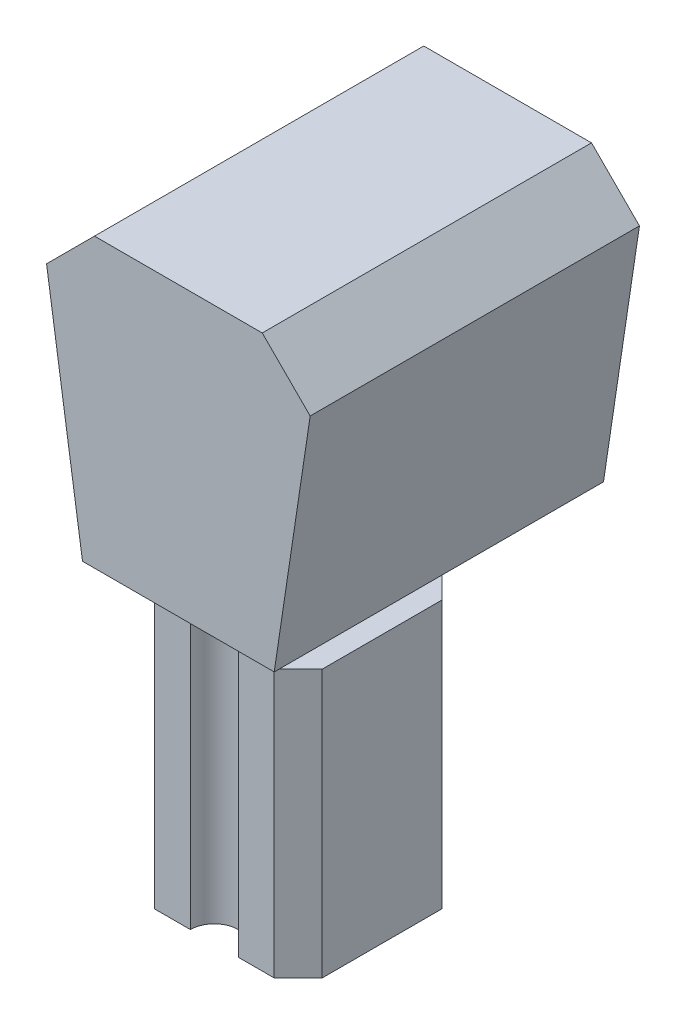
ISO-10303-21;
HEADER;
FILE_DESCRIPTION(('STEP AP214'),'2;1');
FILE_NAME('part.step','',(''),(''),'','','');
FILE_SCHEMA(('AUTOMOTIVE_DESIGN { 1 0 10303 214 1 1 1 1 }'));
ENDSEC;
DATA;
#1=APPLICATION_CONTEXT('core data for automotive mechanical design processes');
#2=APPLICATION_PROTOCOL_DEFINITION('international standard','automotive_design',2000,#1);
#3=PRODUCT_CONTEXT('',#1,'mechanical');
#4=PRODUCT('Part','Part','',(#3));
#5=PRODUCT_RELATED_PRODUCT_CATEGORY('part','',(#4));
#6=PRODUCT_DEFINITION_FORMATION('','',#4);
#7=PRODUCT_DEFINITION_CONTEXT('part definition',#1,'design');
#8=PRODUCT_DEFINITION('design','',#6,#7);
#9=PRODUCT_DEFINITION_SHAPE('','',#8);
#10=(LENGTH_UNIT() NAMED_UNIT(*) SI_UNIT(.MILLI.,.METRE.));
#11=(NAMED_UNIT(*) PLANE_ANGLE_UNIT() SI_UNIT($,.RADIAN.));
#12=(NAMED_UNIT(*) SI_UNIT($,.STERADIAN.) SOLID_ANGLE_UNIT());
#13=UNCERTAINTY_MEASURE_WITH_UNIT(LENGTH_MEASURE(1.E-05),#10,'distance_accuracy_value','');
#14=(GEOMETRIC_REPRESENTATION_CONTEXT(3) GLOBAL_UNCERTAINTY_ASSIGNED_CONTEXT((#13)) GLOBAL_UNIT_ASSIGNED_CONTEXT((#10,
#11,#12)) REPRESENTATION_CONTEXT('',''));
#15=CARTESIAN_POINT('',(0.,0.,0.));
#16=DIRECTION('',(0.,0.,1.));
#17=DIRECTION('',(1.,0.,0.));
#18=AXIS2_PLACEMENT_3D('',#15,#16,#17);
#19=CARTESIAN_POINT('',(-175.,-558.,-125.));
#20=DIRECTION('',(-1.,0.,0.));
#21=DIRECTION('',(0.,0.,1.));
#22=AXIS2_PLACEMENT_3D('',#19,#20,#21);
#23=PLANE('',#22);
#24=DIRECTION('',(0.,0.,1.));
#25=VECTOR('',#24,1.);
#26=CARTESIAN_POINT('',(-175.,0.,-125.));
#27=LINE('',#26,#25);
#28=CARTESIAN_POINT('',(-175.,0.,-375.));
#29=VERTEX_POINT('',#28);
#30=CARTESIAN_POINT('',(-175.,0.,-125.));
#31=VERTEX_POINT('',#30);
#32=EDGE_CURVE('E178',#29,#31,#27,.T.);
#33=ORIENTED_EDGE('',*,*,#32,.F.);
#34=DIRECTION('',(0.,1.,0.));
#35=VECTOR('',#34,1.);
#36=CARTESIAN_POINT('',(-175.,-558.,-375.));
#37=LINE('',#36,#35);
#38=CARTESIAN_POINT('',(-175.,-558.,-375.));
#39=VERTEX_POINT('',#38);
#40=EDGE_CURVE('E12',#39,#29,#37,.T.);
#41=ORIENTED_EDGE('',*,*,#40,.F.);
#42=DIRECTION('',(0.,0.,1.));
#43=VECTOR('',#42,1.);
#44=CARTESIAN_POINT('',(-175.,-558.,-125.));
#45=LINE('',#44,#43);
#46=CARTESIAN_POINT('',(-175.,-558.,-125.));
#47=VERTEX_POINT('',#46);
#48=EDGE_CURVE('E210',#39,#47,#45,.T.);
#49=ORIENTED_EDGE('',*,*,#48,.T.);
#50=DIRECTION('',(0.,1.,0.));
#51=VECTOR('',#50,1.);
#52=CARTESIAN_POINT('',(-175.,-558.,-125.));
#53=LINE('',#52,#51);
#54=EDGE_CURVE('E60',#47,#31,#53,.T.);
#55=ORIENTED_EDGE('',*,*,#54,.T.);
#56=EDGE_LOOP('',(#33,#41,#49,#55));
#57=FACE_BOUND('',#56,.T.);
#58=ADVANCED_FACE('F57',(#57),#23,.T.);
#59=CARTESIAN_POINT('',(-175.,-558.,-375.));
#60=DIRECTION('',(-0.707106781186547,0.,-0.707106781186548));
#61=DIRECTION('',(-0.707106781186548,0.,0.707106781186547));
#62=AXIS2_PLACEMENT_3D('',#59,#60,#61);
#63=PLANE('',#62);
#64=DIRECTION('',(-0.707106781186548,0.,0.707106781186547));
#65=VECTOR('',#64,1.);
#66=CARTESIAN_POINT('',(-175.,0.,-375.));
#67=LINE('',#66,#65);
#68=CARTESIAN_POINT('',(-125.,0.,-425.));
#69=VERTEX_POINT('',#68);
#70=EDGE_CURVE('E208',#69,#29,#67,.T.);
#71=ORIENTED_EDGE('',*,*,#70,.F.);
#72=DIRECTION('',(0.,1.,0.));
#73=VECTOR('',#72,1.);
#74=CARTESIAN_POINT('',(-125.,-558.,-425.));
#75=LINE('',#74,#73);
#76=CARTESIAN_POINT('',(-125.,-558.,-425.));
#77=VERTEX_POINT('',#76);
#78=EDGE_CURVE('E66',#77,#69,#75,.T.);
#79=ORIENTED_EDGE('',*,*,#78,.F.);
#80=DIRECTION('',(-0.707106781186548,0.,0.707106781186547));
#81=VECTOR('',#80,1.);
#82=CARTESIAN_POINT('',(-175.,-558.,-375.));
#83=LINE('',#82,#81);
#84=EDGE_CURVE('E168',#77,#39,#83,.T.);
#85=ORIENTED_EDGE('',*,*,#84,.T.);
#86=ORIENTED_EDGE('',*,*,#40,.T.);
#87=EDGE_LOOP('',(#71,#79,#85,#86));
#88=FACE_BOUND('',#87,.T.);
#89=ADVANCED_FACE('F230',(#88),#63,.T.);
#90=CARTESIAN_POINT('',(-125.,-558.,-425.));
#91=DIRECTION('',(0.,0.,-1.));
#92=DIRECTION('',(-1.,0.,0.));
#93=AXIS2_PLACEMENT_3D('',#90,#91,#92);
#94=PLANE('',#93);
#95=DIRECTION('',(-1.,0.,0.));
#96=VECTOR('',#95,1.);
#97=CARTESIAN_POINT('',(-125.,0.,-425.));
#98=LINE('',#97,#96);
#99=CARTESIAN_POINT('',(-50.,0.,-425.));
#100=VERTEX_POINT('',#99);
#101=EDGE_CURVE('E155',#100,#69,#98,.T.);
#102=ORIENTED_EDGE('',*,*,#101,.F.);
#103=DIRECTION('',(0.,1.,0.));
#104=VECTOR('',#103,1.);
#105=CARTESIAN_POINT('',(-50.,-558.,-425.));
#106=LINE('',#105,#104);
#107=CARTESIAN_POINT('',(-50.,-558.,-425.));
#108=VERTEX_POINT('',#107);
#109=EDGE_CURVE('E150',#108,#100,#106,.T.);
#110=ORIENTED_EDGE('',*,*,#109,.F.);
#111=DIRECTION('',(-1.,0.,0.));
#112=VECTOR('',#111,1.);
#113=CARTESIAN_POINT('',(-125.,-558.,-425.));
#114=LINE('',#113,#112);
#115=EDGE_CURVE('E153',#108,#77,#114,.T.);
#116=ORIENTED_EDGE('',*,*,#115,.T.);
#117=ORIENTED_EDGE('',*,*,#78,.T.);
#118=EDGE_LOOP('',(#102,#110,#116,#117));
#119=FACE_BOUND('',#118,.T.);
#120=ADVANCED_FACE('F152',(#119),#94,.T.);
#121=CARTESIAN_POINT('',(0.,-558.,-425.));
#122=DIRECTION('',(0.,1.,0.));
#123=DIRECTION('',(0.,0.,1.));
#124=AXIS2_PLACEMENT_3D('',#121,#122,#123);
#125=CYLINDRICAL_SURFACE('',#124,50.);
#126=CARTESIAN_POINT('',(0.,0.,-425.));
#127=DIRECTION('',(0.,-1.,0.));
#128=DIRECTION('',(0.,0.,1.));
#129=AXIS2_PLACEMENT_3D('',#126,#127,#128);
#130=CIRCLE('',#129,50.);
#131=CARTESIAN_POINT('',(50.,0.,-425.));
#132=VERTEX_POINT('',#131);
#133=EDGE_CURVE('E205',#132,#100,#130,.T.);
#134=ORIENTED_EDGE('',*,*,#133,.F.);
#135=DIRECTION('',(0.,1.,0.));
#136=VECTOR('',#135,1.);
#137=CARTESIAN_POINT('',(50.,-558.,-425.));
#138=LINE('',#137,#136);
#139=CARTESIAN_POINT('',(50.,-558.,-425.));
#140=VERTEX_POINT('',#139);
#141=EDGE_CURVE('E160',#140,#132,#138,.T.);
#142=ORIENTED_EDGE('',*,*,#141,.F.);
#143=CARTESIAN_POINT('',(0.,-558.,-425.));
#144=DIRECTION('',(0.,-1.,0.));
#145=DIRECTION('',(0.,0.,1.));
#146=AXIS2_PLACEMENT_3D('',#143,#144,#145);
#147=CIRCLE('',#146,50.);
#148=EDGE_CURVE('E166',#140,#108,#147,.T.);
#149=ORIENTED_EDGE('',*,*,#148,.T.);
#150=ORIENTED_EDGE('',*,*,#109,.T.);
#151=EDGE_LOOP('',(#134,#142,#149,#150));
#152=FACE_BOUND('',#151,.T.);
#153=ADVANCED_FACE('F170',(#152),#125,.F.);
#154=CARTESIAN_POINT('',(50.,-558.,-425.));
#155=DIRECTION('',(0.,0.,-1.));
#156=DIRECTION('',(-1.,0.,0.));
#157=AXIS2_PLACEMENT_3D('',#154,#155,#156);
#158=PLANE('',#157);
#159=DIRECTION('',(-1.,0.,0.));
#160=VECTOR('',#159,1.);
#161=CARTESIAN_POINT('',(50.,0.,-425.));
#162=LINE('',#161,#160);
#163=CARTESIAN_POINT('',(125.,0.,-425.));
#164=VERTEX_POINT('',#163);
#165=EDGE_CURVE('E202',#164,#132,#162,.T.);
#166=ORIENTED_EDGE('',*,*,#165,.F.);
#167=DIRECTION('',(0.,1.,0.));
#168=VECTOR('',#167,1.);
#169=CARTESIAN_POINT('',(125.,-558.,-425.));
#170=LINE('',#169,#168);
#171=CARTESIAN_POINT('',(125.,-558.,-425.));
#172=VERTEX_POINT('',#171);
#173=EDGE_CURVE('E214',#172,#164,#170,.T.);
#174=ORIENTED_EDGE('',*,*,#173,.F.);
#175=DIRECTION('',(-1.,0.,0.));
#176=VECTOR('',#175,1.);
#177=CARTESIAN_POINT('',(50.,-558.,-425.));
#178=LINE('',#177,#176);
#179=EDGE_CURVE('E171',#172,#140,#178,.T.);
#180=ORIENTED_EDGE('',*,*,#179,.T.);
#181=ORIENTED_EDGE('',*,*,#141,.T.);
#182=EDGE_LOOP('',(#166,#174,#180,#181));
#183=FACE_BOUND('',#182,.T.);
#184=ADVANCED_FACE('F243',(#183),#158,.T.);
#185=CARTESIAN_POINT('',(125.,-558.,-425.));
#186=DIRECTION('',(0.707106781186547,0.,-0.707106781186548));
#187=DIRECTION('',(-0.707106781186548,0.,-0.707106781186547));
#188=AXIS2_PLACEMENT_3D('',#185,#186,#187);
#189=PLANE('',#188);
#190=DIRECTION('',(-0.707106781186548,0.,-0.707106781186547));
#191=VECTOR('',#190,1.);
#192=CARTESIAN_POINT('',(125.,0.,-425.));
#193=LINE('',#192,#191);
#194=CARTESIAN_POINT('',(175.,0.,-375.));
#195=VERTEX_POINT('',#194);
#196=EDGE_CURVE('E199',#195,#164,#193,.T.);
#197=ORIENTED_EDGE('',*,*,#196,.F.);
#198=DIRECTION('',(0.,1.,0.));
#199=VECTOR('',#198,1.);
#200=CARTESIAN_POINT('',(175.,-558.,-375.));
#201=LINE('',#200,#199);
#202=CARTESIAN_POINT('',(175.,-558.,-375.));
#203=VERTEX_POINT('',#202);
#204=EDGE_CURVE('E216',#203,#195,#201,.T.);
#205=ORIENTED_EDGE('',*,*,#204,.F.);
#206=DIRECTION('',(-0.707106781186548,0.,-0.707106781186547));
#207=VECTOR('',#206,1.);
#208=CARTESIAN_POINT('',(125.,-558.,-425.));
#209=LINE('',#208,#207);
#210=EDGE_CURVE('E173',#203,#172,#209,.T.);
#211=ORIENTED_EDGE('',*,*,#210,.T.);
#212=ORIENTED_EDGE('',*,*,#173,.T.);
#213=EDGE_LOOP('',(#197,#205,#211,#212));
#214=FACE_BOUND('',#213,.T.);
#215=ADVANCED_FACE('F246',(#214),#189,.T.);
#216=CARTESIAN_POINT('',(175.,-558.,-125.));
#217=DIRECTION('',(1.,0.,0.));
#218=DIRECTION('',(0.,0.,-1.));
#219=AXIS2_PLACEMENT_3D('',#216,#217,#218);
#220=PLANE('',#219);
#221=DIRECTION('',(0.,0.,-1.));
#222=VECTOR('',#221,1.);
#223=CARTESIAN_POINT('',(175.,0.,-125.));
#224=LINE('',#223,#222);
#225=CARTESIAN_POINT('',(175.,0.,-125.));
#226=VERTEX_POINT('',#225);
#227=EDGE_CURVE('E196',#226,#195,#224,.T.);
#228=ORIENTED_EDGE('',*,*,#227,.F.);
#229=DIRECTION('',(0.,1.,0.));
#230=VECTOR('',#229,1.);
#231=CARTESIAN_POINT('',(175.,-558.,-125.));
#232=LINE('',#231,#230);
#233=CARTESIAN_POINT('',(175.,-558.,-125.));
#234=VERTEX_POINT('',#233);
#235=EDGE_CURVE('E218',#234,#226,#232,.T.);
#236=ORIENTED_EDGE('',*,*,#235,.F.);
#237=DIRECTION('',(0.,0.,-1.));
#238=VECTOR('',#237,1.);
#239=CARTESIAN_POINT('',(175.,-558.,-125.));
#240=LINE('',#239,#238);
#241=EDGE_CURVE('E372',#234,#203,#240,.T.);
#242=ORIENTED_EDGE('',*,*,#241,.T.);
#243=ORIENTED_EDGE('',*,*,#204,.T.);
#244=EDGE_LOOP('',(#228,#236,#242,#243));
#245=FACE_BOUND('',#244,.T.);
#246=ADVANCED_FACE('F250',(#245),#220,.T.);
#247=CARTESIAN_POINT('',(125.,-558.,-74.9999999999998));
#248=DIRECTION('',(0.707106781186548,0.,0.707106781186548));
#249=DIRECTION('',(0.707106781186548,0.,-0.707106781186548));
#250=AXIS2_PLACEMENT_3D('',#247,#248,#249);
#251=PLANE('',#250);
#252=DIRECTION('',(0.707106781186547,0.,-0.707106781186547));
#253=VECTOR('',#252,1.);
#254=CARTESIAN_POINT('',(125.,0.,-74.9999999999998));
#255=LINE('',#254,#253);
#256=CARTESIAN_POINT('',(125.,0.,-74.9999999999998));
#257=VERTEX_POINT('',#256);
#258=EDGE_CURVE('E193',#257,#226,#255,.T.);
#259=ORIENTED_EDGE('',*,*,#258,.F.);
#260=DIRECTION('',(0.,1.,0.));
#261=VECTOR('',#260,1.);
#262=CARTESIAN_POINT('',(125.,-558.,-74.9999999999998));
#263=LINE('',#262,#261);
#264=CARTESIAN_POINT('',(125.,-558.,-74.9999999999998));
#265=VERTEX_POINT('',#264);
#266=EDGE_CURVE('E220',#265,#257,#263,.T.);
#267=ORIENTED_EDGE('',*,*,#266,.F.);
#268=DIRECTION('',(0.707106781186547,0.,-0.707106781186547));
#269=VECTOR('',#268,1.);
#270=CARTESIAN_POINT('',(125.,-558.,-74.9999999999998));
#271=LINE('',#270,#269);
#272=EDGE_CURVE('E376',#265,#234,#271,.T.);
#273=ORIENTED_EDGE('',*,*,#272,.T.);
#274=ORIENTED_EDGE('',*,*,#235,.T.);
#275=EDGE_LOOP('',(#259,#267,#273,#274));
#276=FACE_BOUND('',#275,.T.);
#277=ADVANCED_FACE('F254',(#276),#251,.T.);
#278=CARTESIAN_POINT('',(50.,-558.,-74.9999999999998));
#279=DIRECTION('',(0.,0.,1.));
#280=DIRECTION('',(1.,0.,0.));
#281=AXIS2_PLACEMENT_3D('',#278,#279,#280);
#282=PLANE('',#281);
#283=DIRECTION('',(1.,0.,0.));
#284=VECTOR('',#283,1.);
#285=CARTESIAN_POINT('',(50.,0.,-74.9999999999998));
#286=LINE('',#285,#284);
#287=CARTESIAN_POINT('',(50.,0.,-74.9999999999998));
#288=VERTEX_POINT('',#287);
#289=EDGE_CURVE('E190',#288,#257,#286,.T.);
#290=ORIENTED_EDGE('',*,*,#289,.F.);
#291=DIRECTION('',(0.,1.,0.));
#292=VECTOR('',#291,1.);
#293=CARTESIAN_POINT('',(50.,-558.,-74.9999999999998));
#294=LINE('',#293,#292);
#295=CARTESIAN_POINT('',(50.,-558.,-74.9999999999998));
#296=VERTEX_POINT('',#295);
#297=EDGE_CURVE('E222',#296,#288,#294,.T.);
#298=ORIENTED_EDGE('',*,*,#297,.F.);
#299=DIRECTION('',(1.,0.,0.));
#300=VECTOR('',#299,1.);
#301=CARTESIAN_POINT('',(50.,-558.,-74.9999999999998));
#302=LINE('',#301,#300);
#303=EDGE_CURVE('E365',#296,#265,#302,.T.);
#304=ORIENTED_EDGE('',*,*,#303,.T.);
#305=ORIENTED_EDGE('',*,*,#266,.T.);
#306=EDGE_LOOP('',(#290,#298,#304,#305));
#307=FACE_BOUND('',#306,.T.);
#308=ADVANCED_FACE('F258',(#307),#282,.T.);
#309=CARTESIAN_POINT('',(0.,-558.,-74.9999999999998));
#310=DIRECTION('',(0.,1.,0.));
#311=DIRECTION('',(0.,0.,1.));
#312=AXIS2_PLACEMENT_3D('',#309,#310,#311);
#313=CYLINDRICAL_SURFACE('',#312,50.);
#314=CARTESIAN_POINT('',(0.,0.,-74.9999999999998));
#315=DIRECTION('',(0.,-1.,0.));
#316=DIRECTION('',(0.,0.,1.));
#317=AXIS2_PLACEMENT_3D('',#314,#315,#316);
#318=CIRCLE('',#317,50.);
#319=CARTESIAN_POINT('',(-50.,0.,-74.9999999999998));
#320=VERTEX_POINT('',#319);
#321=EDGE_CURVE('E187',#320,#288,#318,.T.);
#322=ORIENTED_EDGE('',*,*,#321,.F.);
#323=DIRECTION('',(0.,1.,0.));
#324=VECTOR('',#323,1.);
#325=CARTESIAN_POINT('',(-50.,-558.,-74.9999999999998));
#326=LINE('',#325,#324);
#327=CARTESIAN_POINT('',(-50.,-558.,-74.9999999999998));
#328=VERTEX_POINT('',#327);
#329=EDGE_CURVE('E224',#328,#320,#326,.T.);
#330=ORIENTED_EDGE('',*,*,#329,.F.);
#331=CARTESIAN_POINT('',(0.,-558.,-74.9999999999998));
#332=DIRECTION('',(0.,-1.,0.));
#333=DIRECTION('',(0.,0.,1.));
#334=AXIS2_PLACEMENT_3D('',#331,#332,#333);
#335=CIRCLE('',#334,50.);
#336=EDGE_CURVE('E361',#328,#296,#335,.T.);
#337=ORIENTED_EDGE('',*,*,#336,.T.);
#338=ORIENTED_EDGE('',*,*,#297,.T.);
#339=EDGE_LOOP('',(#322,#330,#337,#338));
#340=FACE_BOUND('',#339,.T.);
#341=ADVANCED_FACE('F262',(#340),#313,.F.);
#342=CARTESIAN_POINT('',(-125.,-558.,-74.9999999999998));
#343=DIRECTION('',(0.,0.,1.));
#344=DIRECTION('',(1.,0.,0.));
#345=AXIS2_PLACEMENT_3D('',#342,#343,#344);
#346=PLANE('',#345);
#347=DIRECTION('',(1.,0.,0.));
#348=VECTOR('',#347,1.);
#349=CARTESIAN_POINT('',(-125.,0.,-74.9999999999998));
#350=LINE('',#349,#348);
#351=CARTESIAN_POINT('',(-125.,0.,-74.9999999999998));
#352=VERTEX_POINT('',#351);
#353=EDGE_CURVE('E184',#352,#320,#350,.T.);
#354=ORIENTED_EDGE('',*,*,#353,.F.);
#355=DIRECTION('',(0.,1.,0.));
#356=VECTOR('',#355,1.);
#357=CARTESIAN_POINT('',(-125.,-558.,-74.9999999999998));
#358=LINE('',#357,#356);
#359=CARTESIAN_POINT('',(-125.,-558.,-74.9999999999998));
#360=VERTEX_POINT('',#359);
#361=EDGE_CURVE('E225',#360,#352,#358,.T.);
#362=ORIENTED_EDGE('',*,*,#361,.F.);
#363=DIRECTION('',(1.,0.,0.));
#364=VECTOR('',#363,1.);
#365=CARTESIAN_POINT('',(-125.,-558.,-74.9999999999998));
#366=LINE('',#365,#364);
#367=EDGE_CURVE('E382',#360,#328,#366,.T.);
#368=ORIENTED_EDGE('',*,*,#367,.T.);
#369=ORIENTED_EDGE('',*,*,#329,.T.);
#370=EDGE_LOOP('',(#354,#362,#368,#369));
#371=FACE_BOUND('',#370,.T.);
#372=ADVANCED_FACE('F266',(#371),#346,.T.);
#373=CARTESIAN_POINT('',(-175.,-558.,-125.));
#374=DIRECTION('',(-0.707106781186547,0.,0.707106781186548));
#375=DIRECTION('',(0.707106781186548,0.,0.707106781186547));
#376=AXIS2_PLACEMENT_3D('',#373,#374,#375);
#377=PLANE('',#376);
#378=DIRECTION('',(0.707106781186548,0.,0.707106781186547));
#379=VECTOR('',#378,1.);
#380=CARTESIAN_POINT('',(-175.,0.,-125.));
#381=LINE('',#380,#379);
#382=EDGE_CURVE('E181',#31,#352,#381,.T.);
#383=ORIENTED_EDGE('',*,*,#382,.F.);
#384=ORIENTED_EDGE('',*,*,#54,.F.);
#385=DIRECTION('',(0.707106781186548,0.,0.707106781186547));
#386=VECTOR('',#385,1.);
#387=CARTESIAN_POINT('',(-175.,-558.,-125.));
#388=LINE('',#387,#386);
#389=EDGE_CURVE('E384',#47,#360,#388,.T.);
#390=ORIENTED_EDGE('',*,*,#389,.T.);
#391=ORIENTED_EDGE('',*,*,#361,.T.);
#392=EDGE_LOOP('',(#383,#384,#390,#391));
#393=FACE_BOUND('',#392,.T.);
#394=ADVANCED_FACE('F227',(#393),#377,.T.);
#395=CARTESIAN_POINT('',(0.,-558.,-425.));
#396=DIRECTION('',(0.,1.,0.));
#397=DIRECTION('',(0.,0.,1.));
#398=AXIS2_PLACEMENT_3D('',#395,#396,#397);
#399=PLANE('',#398);
#400=ORIENTED_EDGE('',*,*,#48,.F.);
#401=ORIENTED_EDGE('',*,*,#84,.F.);
#402=ORIENTED_EDGE('',*,*,#115,.F.);
#403=ORIENTED_EDGE('',*,*,#148,.F.);
#404=ORIENTED_EDGE('',*,*,#179,.F.);
#405=ORIENTED_EDGE('',*,*,#210,.F.);
#406=ORIENTED_EDGE('',*,*,#241,.F.);
#407=ORIENTED_EDGE('',*,*,#272,.F.);
#408=ORIENTED_EDGE('',*,*,#303,.F.);
#409=ORIENTED_EDGE('',*,*,#336,.F.);
#410=ORIENTED_EDGE('',*,*,#367,.F.);
#411=ORIENTED_EDGE('',*,*,#389,.F.);
#412=EDGE_LOOP('',(#400,#401,#402,#403,#404,#405,#406,#407,#408,#409,#410,#411));
#413=FACE_BOUND('',#412,.T.);
#414=ADVANCED_FACE('F164',(#413),#399,.F.);
#415=CARTESIAN_POINT('',(0.,0.,-425.));
#416=DIRECTION('',(0.,1.,0.));
#417=DIRECTION('',(0.,0.,1.));
#418=AXIS2_PLACEMENT_3D('',#415,#416,#417);
#419=PLANE('',#418);
#420=ORIENTED_EDGE('',*,*,#32,.T.);
#421=ORIENTED_EDGE('',*,*,#382,.T.);
#422=ORIENTED_EDGE('',*,*,#353,.T.);
#423=ORIENTED_EDGE('',*,*,#321,.T.);
#424=ORIENTED_EDGE('',*,*,#289,.T.);
#425=ORIENTED_EDGE('',*,*,#258,.T.);
#426=ORIENTED_EDGE('',*,*,#227,.T.);
#427=ORIENTED_EDGE('',*,*,#196,.T.);
#428=ORIENTED_EDGE('',*,*,#165,.T.);
#429=ORIENTED_EDGE('',*,*,#133,.T.);
#430=ORIENTED_EDGE('',*,*,#101,.T.);
#431=ORIENTED_EDGE('',*,*,#70,.T.);
#432=EDGE_LOOP('',(#420,#421,#422,#423,#424,#425,#426,#427,#428,#429,#430,#431));
#433=FACE_BOUND('',#432,.T.);
#434=ADVANCED_FACE('F229',(#433),#419,.T.);
#435=CLOSED_SHELL('',(#58,#89,#120,#153,#184,#215,#246,#277,#308,#341,#372,#394,#414,#434));
#436=MANIFOLD_SOLID_BREP('B2',#435);
#437=CARTESIAN_POINT('',(-175.,670.,-687.));
#438=DIRECTION('',(-0.707106781186547,0.707106781186548,0.));
#439=DIRECTION('',(-0.707106781186548,-0.707106781186547,0.));
#440=AXIS2_PLACEMENT_3D('',#437,#438,#439);
#441=PLANE('',#440);
#442=DIRECTION('',(-0.707106781186548,-0.707106781186547,0.));
#443=VECTOR('',#442,1.);
#444=CARTESIAN_POINT('',(-175.,670.,0.));
#445=LINE('',#444,#443);
#446=CARTESIAN_POINT('',(-175.,670.,0.));
#447=VERTEX_POINT('',#446);
#448=CARTESIAN_POINT('',(-275.,570.,0.));
#449=VERTEX_POINT('',#448);
#450=EDGE_CURVE('E480',#447,#449,#445,.T.);
#451=ORIENTED_EDGE('',*,*,#450,.F.);
#452=DIRECTION('',(0.,0.,1.));
#453=VECTOR('',#452,1.);
#454=CARTESIAN_POINT('',(-175.,670.,-687.));
#455=LINE('',#454,#453);
#456=CARTESIAN_POINT('',(-175.,670.,-687.));
#457=VERTEX_POINT('',#456);
#458=EDGE_CURVE('E55',#457,#447,#455,.T.);
#459=ORIENTED_EDGE('',*,*,#458,.F.);
#460=DIRECTION('',(-0.707106781186548,-0.707106781186547,0.));
#461=VECTOR('',#460,1.);
#462=CARTESIAN_POINT('',(-175.,670.,-687.));
#463=LINE('',#462,#461);
#464=CARTESIAN_POINT('',(-275.,570.,-687.));
#465=VERTEX_POINT('',#464);
#466=EDGE_CURVE('E500',#457,#465,#463,.T.);
#467=ORIENTED_EDGE('',*,*,#466,.T.);
#468=DIRECTION('',(0.,0.,1.));
#469=VECTOR('',#468,1.);
#470=CARTESIAN_POINT('',(-275.,570.,-687.));
#471=LINE('',#470,#469);
#472=EDGE_CURVE('E392',#465,#449,#471,.T.);
#473=ORIENTED_EDGE('',*,*,#472,.T.);
#474=EDGE_LOOP('',(#451,#459,#467,#473));
#475=FACE_BOUND('',#474,.T.);
#476=ADVANCED_FACE('F389',(#475),#441,.T.);
#477=CARTESIAN_POINT('',(175.,670.,-687.));
#478=DIRECTION('',(0.,1.,0.));
#479=DIRECTION('',(0.,0.,1.));
#480=AXIS2_PLACEMENT_3D('',#477,#478,#479);
#481=PLANE('',#480);
#482=DIRECTION('',(-1.,0.,0.));
#483=VECTOR('',#482,1.);
#484=CARTESIAN_POINT('',(175.,670.,0.));
#485=LINE('',#484,#483);
#486=CARTESIAN_POINT('',(175.,670.,0.));
#487=VERTEX_POINT('',#486);
#488=EDGE_CURVE('E497',#487,#447,#485,.T.);
#489=ORIENTED_EDGE('',*,*,#488,.F.);
#490=DIRECTION('',(0.,0.,1.));
#491=VECTOR('',#490,1.);
#492=CARTESIAN_POINT('',(175.,670.,-687.));
#493=LINE('',#492,#491);
#494=CARTESIAN_POINT('',(175.,670.,-687.));
#495=VERTEX_POINT('',#494);
#496=EDGE_CURVE('E399',#495,#487,#493,.T.);
#497=ORIENTED_EDGE('',*,*,#496,.F.);
#498=DIRECTION('',(-1.,0.,0.));
#499=VECTOR('',#498,1.);
#500=CARTESIAN_POINT('',(175.,670.,-687.));
#501=LINE('',#500,#499);
#502=EDGE_CURVE('E466',#495,#457,#501,.T.);
#503=ORIENTED_EDGE('',*,*,#502,.T.);
#504=ORIENTED_EDGE('',*,*,#458,.T.);
#505=EDGE_LOOP('',(#489,#497,#503,#504));
#506=FACE_BOUND('',#505,.T.);
#507=ADVANCED_FACE('F512',(#506),#481,.T.);
#508=CARTESIAN_POINT('',(275.,570.,-687.));
#509=DIRECTION('',(0.707106781186547,0.707106781186548,0.));
#510=DIRECTION('',(-0.707106781186548,0.707106781186547,0.));
#511=AXIS2_PLACEMENT_3D('',#508,#509,#510);
#512=PLANE('',#511);
#513=DIRECTION('',(-0.707106781186548,0.707106781186547,0.));
#514=VECTOR('',#513,1.);
#515=CARTESIAN_POINT('',(275.,570.,0.));
#516=LINE('',#515,#514);
#517=CARTESIAN_POINT('',(275.,570.,0.));
#518=VERTEX_POINT('',#517);
#519=EDGE_CURVE('E452',#518,#487,#516,.T.);
#520=ORIENTED_EDGE('',*,*,#519,.F.);
#521=DIRECTION('',(0.,0.,1.));
#522=VECTOR('',#521,1.);
#523=CARTESIAN_POINT('',(275.,570.,-687.));
#524=LINE('',#523,#522);
#525=CARTESIAN_POINT('',(275.,570.,-687.));
#526=VERTEX_POINT('',#525);
#527=EDGE_CURVE('E447',#526,#518,#524,.T.);
#528=ORIENTED_EDGE('',*,*,#527,.F.);
#529=DIRECTION('',(-0.707106781186548,0.707106781186547,0.));
#530=VECTOR('',#529,1.);
#531=CARTESIAN_POINT('',(275.,570.,-687.));
#532=LINE('',#531,#530);
#533=EDGE_CURVE('E450',#526,#495,#532,.T.);
#534=ORIENTED_EDGE('',*,*,#533,.T.);
#535=ORIENTED_EDGE('',*,*,#496,.T.);
#536=EDGE_LOOP('',(#520,#528,#534,#535));
#537=FACE_BOUND('',#536,.T.);
#538=ADVANCED_FACE('F449',(#537),#512,.T.);
#539=CARTESIAN_POINT('',(200.,70.,-687.));
#540=DIRECTION('',(0.988936352868298,-0.148340452930245,0.));
#541=DIRECTION('',(0.148340452930245,0.988936352868298,0.));
#542=AXIS2_PLACEMENT_3D('',#539,#540,#541);
#543=PLANE('',#542);
#544=DIRECTION('',(0.148340452930245,0.988936352868297,0.));
#545=VECTOR('',#544,1.);
#546=CARTESIAN_POINT('',(200.,70.,0.));
#547=LINE('',#546,#545);
#548=CARTESIAN_POINT('',(200.,70.,0.));
#549=VERTEX_POINT('',#548);
#550=EDGE_CURVE('E492',#549,#518,#547,.T.);
#551=ORIENTED_EDGE('',*,*,#550,.F.);
#552=DIRECTION('',(0.,0.,1.));
#553=VECTOR('',#552,1.);
#554=CARTESIAN_POINT('',(200.,70.,-687.));
#555=LINE('',#554,#553);
#556=CARTESIAN_POINT('',(200.,70.,-687.));
#557=VERTEX_POINT('',#556);
#558=EDGE_CURVE('E458',#557,#549,#555,.T.);
#559=ORIENTED_EDGE('',*,*,#558,.F.);
#560=DIRECTION('',(0.148340452930245,0.988936352868297,0.));
#561=VECTOR('',#560,1.);
#562=CARTESIAN_POINT('',(200.,70.,-687.));
#563=LINE('',#562,#561);
#564=EDGE_CURVE('E464',#557,#526,#563,.T.);
#565=ORIENTED_EDGE('',*,*,#564,.T.);
#566=ORIENTED_EDGE('',*,*,#527,.T.);
#567=EDGE_LOOP('',(#551,#559,#565,#566));
#568=FACE_BOUND('',#567,.T.);
#569=ADVANCED_FACE('F469',(#568),#543,.T.);
#570=CARTESIAN_POINT('',(-200.,70.,-687.));
#571=DIRECTION('',(0.,-1.,0.));
#572=DIRECTION('',(0.,0.,-1.));
#573=AXIS2_PLACEMENT_3D('',#570,#571,#572);
#574=PLANE('',#573);
#575=DIRECTION('',(1.,0.,0.));
#576=VECTOR('',#575,1.);
#577=CARTESIAN_POINT('',(-200.,70.,0.));
#578=LINE('',#577,#576);
#579=CARTESIAN_POINT('',(-200.,70.,0.));
#580=VERTEX_POINT('',#579);
#581=EDGE_CURVE('E488',#580,#549,#578,.T.);
#582=ORIENTED_EDGE('',*,*,#581,.F.);
#583=DIRECTION('',(0.,0.,1.));
#584=VECTOR('',#583,1.);
#585=CARTESIAN_POINT('',(-200.,70.,-687.));
#586=LINE('',#585,#584);
#587=CARTESIAN_POINT('',(-200.,70.,-687.));
#588=VERTEX_POINT('',#587);
#589=EDGE_CURVE('E505',#588,#580,#586,.T.);
#590=ORIENTED_EDGE('',*,*,#589,.F.);
#591=DIRECTION('',(1.,0.,0.));
#592=VECTOR('',#591,1.);
#593=CARTESIAN_POINT('',(-200.,70.,-687.));
#594=LINE('',#593,#592);
#595=EDGE_CURVE('E471',#588,#557,#594,.T.);
#596=ORIENTED_EDGE('',*,*,#595,.T.);
#597=ORIENTED_EDGE('',*,*,#558,.T.);
#598=EDGE_LOOP('',(#582,#590,#596,#597));
#599=FACE_BOUND('',#598,.T.);
#600=ADVANCED_FACE('F525',(#599),#574,.T.);
#601=CARTESIAN_POINT('',(-275.,570.,-687.));
#602=DIRECTION('',(-0.988936352868298,-0.148340452930245,0.));
#603=DIRECTION('',(0.148340452930245,-0.988936352868298,0.));
#604=AXIS2_PLACEMENT_3D('',#601,#602,#603);
#605=PLANE('',#604);
#606=DIRECTION('',(0.148340452930245,-0.988936352868297,0.));
#607=VECTOR('',#606,1.);
#608=CARTESIAN_POINT('',(-275.,570.,0.));
#609=LINE('',#608,#607);
#610=EDGE_CURVE('E484',#449,#580,#609,.T.);
#611=ORIENTED_EDGE('',*,*,#610,.F.);
#612=ORIENTED_EDGE('',*,*,#472,.F.);
#613=DIRECTION('',(0.148340452930245,-0.988936352868297,0.));
#614=VECTOR('',#613,1.);
#615=CARTESIAN_POINT('',(-275.,570.,-687.));
#616=LINE('',#615,#614);
#617=EDGE_CURVE('E474',#465,#588,#616,.T.);
#618=ORIENTED_EDGE('',*,*,#617,.T.);
#619=ORIENTED_EDGE('',*,*,#589,.T.);
#620=EDGE_LOOP('',(#611,#612,#618,#619));
#621=FACE_BOUND('',#620,.T.);
#622=ADVANCED_FACE('F509',(#621),#605,.T.);
#623=CARTESIAN_POINT('',(0.,0.,-687.));
#624=DIRECTION('',(0.,0.,-1.));
#625=DIRECTION('',(-1.,0.,0.));
#626=AXIS2_PLACEMENT_3D('',#623,#624,#625);
#627=PLANE('',#626);
#628=ORIENTED_EDGE('',*,*,#466,.F.);
#629=ORIENTED_EDGE('',*,*,#502,.F.);
#630=ORIENTED_EDGE('',*,*,#533,.F.);
#631=ORIENTED_EDGE('',*,*,#564,.F.);
#632=ORIENTED_EDGE('',*,*,#595,.F.);
#633=ORIENTED_EDGE('',*,*,#617,.F.);
#634=EDGE_LOOP('',(#628,#629,#630,#631,#632,#633));
#635=FACE_BOUND('',#634,.T.);
#636=ADVANCED_FACE('F462',(#635),#627,.T.);
#637=CARTESIAN_POINT('',(0.,0.,0.));
#638=DIRECTION('',(0.,0.,-1.));
#639=DIRECTION('',(-1.,0.,0.));
#640=AXIS2_PLACEMENT_3D('',#637,#638,#639);
#641=PLANE('',#640);
#642=ORIENTED_EDGE('',*,*,#450,.T.);
#643=ORIENTED_EDGE('',*,*,#610,.T.);
#644=ORIENTED_EDGE('',*,*,#581,.T.);
#645=ORIENTED_EDGE('',*,*,#550,.T.);
#646=ORIENTED_EDGE('',*,*,#519,.T.);
#647=ORIENTED_EDGE('',*,*,#488,.T.);
#648=EDGE_LOOP('',(#642,#643,#644,#645,#646,#647));
#649=FACE_BOUND('',#648,.T.);
#650=ADVANCED_FACE('F511',(#649),#641,.F.);
#651=CLOSED_SHELL('',(#476,#507,#538,#569,#600,#622,#636,#650));
#652=MANIFOLD_SOLID_BREP('B6',#651);
#653=ADVANCED_BREP_SHAPE_REPRESENTATION('',(#18,#436,#652),#14);
#654=SHAPE_DEFINITION_REPRESENTATION(#9,#653);
ENDSEC;
END-ISO-10303-21;
